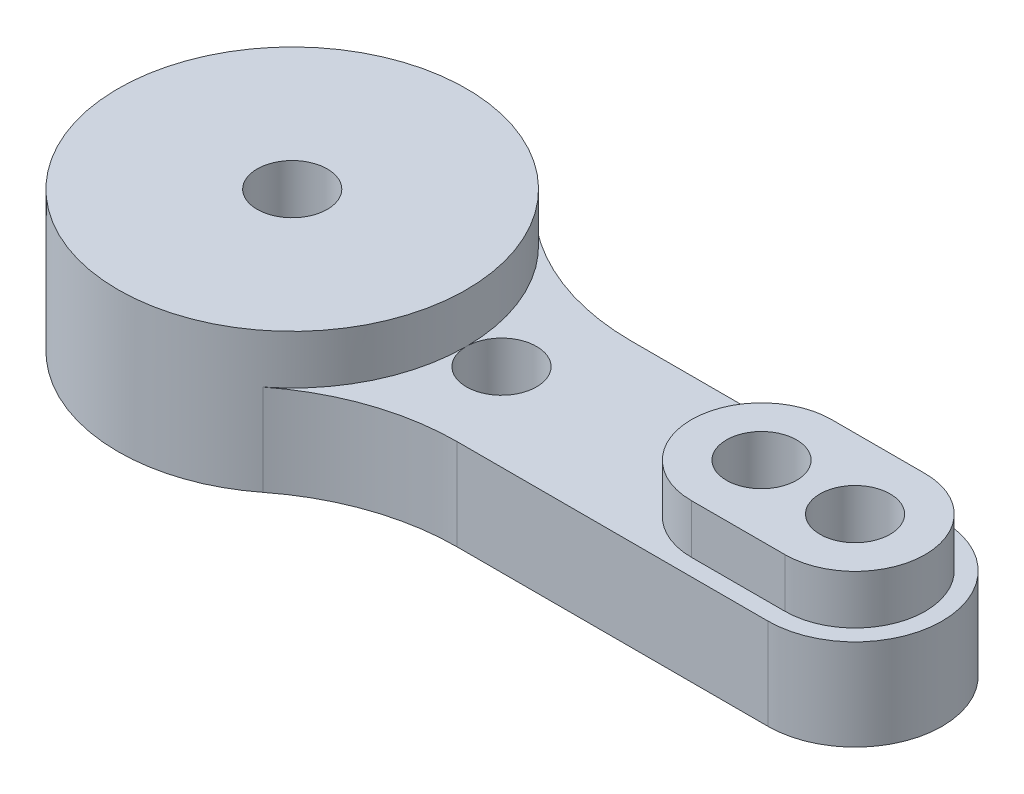
ISO-10303-21;
HEADER;
FILE_DESCRIPTION(('STEP AP214'),'2;1');
FILE_NAME('part.step','',(''),(''),'','','');
FILE_SCHEMA(('AUTOMOTIVE_DESIGN { 1 0 10303 214 1 1 1 1 }'));
ENDSEC;
DATA;
#1=APPLICATION_CONTEXT('core data for automotive mechanical design processes');
#2=APPLICATION_PROTOCOL_DEFINITION('international standard','automotive_design',2000,#1);
#3=PRODUCT_CONTEXT('',#1,'mechanical');
#4=PRODUCT('Part','Part','',(#3));
#5=PRODUCT_RELATED_PRODUCT_CATEGORY('part','',(#4));
#6=PRODUCT_DEFINITION_FORMATION('','',#4);
#7=PRODUCT_DEFINITION_CONTEXT('part definition',#1,'design');
#8=PRODUCT_DEFINITION('design','',#6,#7);
#9=PRODUCT_DEFINITION_SHAPE('','',#8);
#10=(LENGTH_UNIT() NAMED_UNIT(*) SI_UNIT(.MILLI.,.METRE.));
#11=(NAMED_UNIT(*) PLANE_ANGLE_UNIT() SI_UNIT($,.RADIAN.));
#12=(NAMED_UNIT(*) SI_UNIT($,.STERADIAN.) SOLID_ANGLE_UNIT());
#13=UNCERTAINTY_MEASURE_WITH_UNIT(LENGTH_MEASURE(1.E-05),#10,'distance_accuracy_value','');
#14=(GEOMETRIC_REPRESENTATION_CONTEXT(3) GLOBAL_UNCERTAINTY_ASSIGNED_CONTEXT((#13)) GLOBAL_UNIT_ASSIGNED_CONTEXT((#10,
#11,#12)) REPRESENTATION_CONTEXT('',''));
#15=CARTESIAN_POINT('',(0.,0.,0.));
#16=DIRECTION('',(0.,0.,1.));
#17=DIRECTION('',(1.,0.,0.));
#18=AXIS2_PLACEMENT_3D('',#15,#16,#17);
#19=CARTESIAN_POINT('',(0.,-3.9,-3.725));
#20=DIRECTION('',(0.,0.,1.));
#21=DIRECTION('',(1.,0.,0.));
#22=AXIS2_PLACEMENT_3D('',#19,#20,#21);
#23=PLANE('',#22);
#24=DIRECTION('',(1.,0.,0.));
#25=VECTOR('',#24,1.);
#26=CARTESIAN_POINT('',(0.,-3.9,-3.725));
#27=LINE('',#26,#25);
#28=CARTESIAN_POINT('',(10.7762180286035,-3.9,-3.725));
#29=VERTEX_POINT('',#28);
#30=CARTESIAN_POINT('',(24.0716502996323,-3.9,-3.725));
#31=VERTEX_POINT('',#30);
#32=EDGE_CURVE('E214',#29,#31,#27,.T.);
#33=ORIENTED_EDGE('',*,*,#32,.F.);
#34=DIRECTION('',(0.,-1.,0.));
#35=VECTOR('',#34,1.);
#36=CARTESIAN_POINT('',(10.7762180286035,0.,-3.725));
#37=LINE('',#36,#35);
#38=CARTESIAN_POINT('',(10.7762180286035,0.,-3.725));
#39=VERTEX_POINT('',#38);
#40=EDGE_CURVE('E136',#29,#39,#37,.F.);
#41=ORIENTED_EDGE('',*,*,#40,.T.);
#42=DIRECTION('',(1.,0.,0.));
#43=VECTOR('',#42,1.);
#44=CARTESIAN_POINT('',(0.,0.,-3.725));
#45=LINE('',#44,#43);
#46=CARTESIAN_POINT('',(24.0716502996323,0.,-3.725));
#47=VERTEX_POINT('',#46);
#48=EDGE_CURVE('E152',#39,#47,#45,.T.);
#49=ORIENTED_EDGE('',*,*,#48,.T.);
#50=DIRECTION('',(0.,1.,0.));
#51=VECTOR('',#50,1.);
#52=CARTESIAN_POINT('',(24.0716502996323,-3.9,-3.725));
#53=LINE('',#52,#51);
#54=EDGE_CURVE('E137',#31,#47,#53,.T.);
#55=ORIENTED_EDGE('',*,*,#54,.F.);
#56=EDGE_LOOP('',(#33,#41,#49,#55));
#57=FACE_BOUND('',#56,.T.);
#58=ADVANCED_FACE('F47',(#57),#23,.F.);
#59=CARTESIAN_POINT('',(24.0716502996323,-3.9,0.));
#60=DIRECTION('',(0.,1.,0.));
#61=DIRECTION('',(0.,0.,1.));
#62=AXIS2_PLACEMENT_3D('',#59,#60,#61);
#63=CYLINDRICAL_SURFACE('',#62,3.725);
#64=CARTESIAN_POINT('',(24.0716502996323,0.,0.));
#65=DIRECTION('',(0.,1.,0.));
#66=DIRECTION('',(0.,0.,1.));
#67=AXIS2_PLACEMENT_3D('',#64,#65,#66);
#68=CIRCLE('',#67,3.725);
#69=CARTESIAN_POINT('',(24.0716502996323,0.,3.725));
#70=VERTEX_POINT('',#69);
#71=EDGE_CURVE('E167',#70,#47,#68,.T.);
#72=ORIENTED_EDGE('',*,*,#71,.F.);
#73=DIRECTION('',(0.,1.,0.));
#74=VECTOR('',#73,1.);
#75=CARTESIAN_POINT('',(24.0716502996323,-3.9,3.725));
#76=LINE('',#75,#74);
#77=CARTESIAN_POINT('',(24.0716502996323,-3.9,3.725));
#78=VERTEX_POINT('',#77);
#79=EDGE_CURVE('E175',#78,#70,#76,.T.);
#80=ORIENTED_EDGE('',*,*,#79,.F.);
#81=CARTESIAN_POINT('',(24.0716502996323,-3.9,0.));
#82=DIRECTION('',(0.,1.,0.));
#83=DIRECTION('',(0.,0.,1.));
#84=AXIS2_PLACEMENT_3D('',#81,#82,#83);
#85=CIRCLE('',#84,3.725);
#86=EDGE_CURVE('E203',#78,#31,#85,.T.);
#87=ORIENTED_EDGE('',*,*,#86,.T.);
#88=ORIENTED_EDGE('',*,*,#54,.T.);
#89=EDGE_LOOP('',(#72,#80,#87,#88));
#90=FACE_BOUND('',#89,.T.);
#91=ADVANCED_FACE('F304',(#90),#63,.T.);
#92=CARTESIAN_POINT('',(0.,-3.9,3.725));
#93=DIRECTION('',(0.,0.,1.));
#94=DIRECTION('',(1.,0.,0.));
#95=AXIS2_PLACEMENT_3D('',#92,#93,#94);
#96=PLANE('',#95);
#97=DIRECTION('',(1.,0.,0.));
#98=VECTOR('',#97,1.);
#99=CARTESIAN_POINT('',(0.,0.,3.725));
#100=LINE('',#99,#98);
#101=CARTESIAN_POINT('',(10.7762180286035,0.,3.725));
#102=VERTEX_POINT('',#101);
#103=EDGE_CURVE('E157',#102,#70,#100,.T.);
#104=ORIENTED_EDGE('',*,*,#103,.F.);
#105=DIRECTION('',(0.,1.,0.));
#106=VECTOR('',#105,1.);
#107=CARTESIAN_POINT('',(10.7762180286035,-3.9,3.725));
#108=LINE('',#107,#106);
#109=CARTESIAN_POINT('',(10.7762180286035,-3.9,3.725));
#110=VERTEX_POINT('',#109);
#111=EDGE_CURVE('E63',#102,#110,#108,.F.);
#112=ORIENTED_EDGE('',*,*,#111,.T.);
#113=DIRECTION('',(1.,0.,0.));
#114=VECTOR('',#113,1.);
#115=CARTESIAN_POINT('',(0.,-3.9,3.725));
#116=LINE('',#115,#114);
#117=EDGE_CURVE('E207',#110,#78,#116,.T.);
#118=ORIENTED_EDGE('',*,*,#117,.T.);
#119=ORIENTED_EDGE('',*,*,#79,.T.);
#120=EDGE_LOOP('',(#104,#112,#118,#119));
#121=FACE_BOUND('',#120,.T.);
#122=ADVANCED_FACE('F309',(#121),#96,.T.);
#123=CARTESIAN_POINT('',(20.0716502996323,-3.9,0.));
#124=DIRECTION('',(0.,1.,0.));
#125=DIRECTION('',(0.,0.,1.));
#126=AXIS2_PLACEMENT_3D('',#123,#124,#125);
#127=CYLINDRICAL_SURFACE('',#126,1.5);
#128=CARTESIAN_POINT('',(20.0716502996323,-3.9,0.));
#129=DIRECTION('',(0.,1.,0.));
#130=DIRECTION('',(0.,0.,1.));
#131=AXIS2_PLACEMENT_3D('',#128,#129,#130);
#132=CIRCLE('',#131,1.5);
#133=CARTESIAN_POINT('',(20.0716502996323,-3.9,1.5));
#134=VERTEX_POINT('',#133);
#135=EDGE_CURVE('E197',#134,#134,#132,.T.);
#136=ORIENTED_EDGE('',*,*,#135,.F.);
#137=EDGE_LOOP('',(#136));
#138=FACE_BOUND('',#137,.T.);
#139=CARTESIAN_POINT('',(20.0716502996323,2.1,0.));
#140=DIRECTION('',(0.,1.,0.));
#141=DIRECTION('',(0.,0.,1.));
#142=AXIS2_PLACEMENT_3D('',#139,#140,#141);
#143=CIRCLE('',#142,1.5);
#144=CARTESIAN_POINT('',(20.0716502996323,2.1,1.5));
#145=VERTEX_POINT('',#144);
#146=EDGE_CURVE('E237',#145,#145,#143,.T.);
#147=ORIENTED_EDGE('',*,*,#146,.T.);
#148=EDGE_LOOP('',(#147));
#149=FACE_BOUND('',#148,.T.);
#150=ADVANCED_FACE('F298',(#138,#149),#127,.F.);
#151=CARTESIAN_POINT('',(0.,-3.9,0.));
#152=DIRECTION('',(0.,1.,0.));
#153=DIRECTION('',(0.,0.,1.));
#154=AXIS2_PLACEMENT_3D('',#151,#152,#153);
#155=CYLINDRICAL_SURFACE('',#154,1.5);
#156=CARTESIAN_POINT('',(0.,-3.9,0.));
#157=DIRECTION('',(0.,1.,0.));
#158=DIRECTION('',(0.,0.,1.));
#159=AXIS2_PLACEMENT_3D('',#156,#157,#158);
#160=CIRCLE('',#159,1.5);
#161=CARTESIAN_POINT('',(0.,-3.9,1.5));
#162=VERTEX_POINT('',#161);
#163=EDGE_CURVE('E200',#162,#162,#160,.T.);
#164=ORIENTED_EDGE('',*,*,#163,.F.);
#165=EDGE_LOOP('',(#164));
#166=FACE_BOUND('',#165,.T.);
#167=CARTESIAN_POINT('',(0.,2.1,0.));
#168=DIRECTION('',(0.,1.,0.));
#169=DIRECTION('',(0.,0.,1.));
#170=AXIS2_PLACEMENT_3D('',#167,#168,#169);
#171=CIRCLE('',#170,1.5);
#172=CARTESIAN_POINT('',(0.,2.1,1.5));
#173=VERTEX_POINT('',#172);
#174=EDGE_CURVE('E147',#173,#173,#171,.T.);
#175=ORIENTED_EDGE('',*,*,#174,.T.);
#176=EDGE_LOOP('',(#175));
#177=FACE_BOUND('',#176,.T.);
#178=ADVANCED_FACE('F278',(#166,#177),#155,.F.);
#179=CARTESIAN_POINT('',(0.,-3.9,0.));
#180=DIRECTION('',(0.,1.,0.));
#181=DIRECTION('',(0.,0.,1.));
#182=AXIS2_PLACEMENT_3D('',#179,#180,#181);
#183=CYLINDRICAL_SURFACE('',#182,7.45);
#184=CARTESIAN_POINT('',(0.,0.,0.));
#185=DIRECTION('',(0.,1.,0.));
#186=DIRECTION('',(0.,0.,1.));
#187=AXIS2_PLACEMENT_3D('',#184,#185,#186);
#188=CIRCLE('',#187,7.45);
#189=CARTESIAN_POINT('',(4.60073491765595,0.,-5.85967048710602));
#190=VERTEX_POINT('',#189);
#191=CARTESIAN_POINT('',(7.45,0.,0.));
#192=VERTEX_POINT('',#191);
#193=EDGE_CURVE('E129',#190,#192,#188,.F.);
#194=ORIENTED_EDGE('',*,*,#193,.F.);
#195=DIRECTION('',(0.,1.,0.));
#196=VECTOR('',#195,1.);
#197=CARTESIAN_POINT('',(4.60073491765595,-3.9,-5.85967048710602));
#198=LINE('',#197,#196);
#199=CARTESIAN_POINT('',(4.60073491765595,-3.9,-5.85967048710602));
#200=VERTEX_POINT('',#199);
#201=EDGE_CURVE('E184',#190,#200,#198,.F.);
#202=ORIENTED_EDGE('',*,*,#201,.T.);
#203=CARTESIAN_POINT('',(0.,-3.9,0.));
#204=DIRECTION('',(0.,1.,0.));
#205=DIRECTION('',(0.,0.,1.));
#206=AXIS2_PLACEMENT_3D('',#203,#204,#205);
#207=CIRCLE('',#206,7.45);
#208=CARTESIAN_POINT('',(4.60073491765595,-3.9,5.85967048710602));
#209=VERTEX_POINT('',#208);
#210=EDGE_CURVE('E210',#209,#200,#207,.F.);
#211=ORIENTED_EDGE('',*,*,#210,.F.);
#212=DIRECTION('',(0.,1.,0.));
#213=VECTOR('',#212,1.);
#214=CARTESIAN_POINT('',(4.60073491765595,-3.9,5.85967048710602));
#215=LINE('',#214,#213);
#216=CARTESIAN_POINT('',(4.60073491765595,0.,5.85967048710602));
#217=VERTEX_POINT('',#216);
#218=EDGE_CURVE('E133',#209,#217,#215,.T.);
#219=ORIENTED_EDGE('',*,*,#218,.T.);
#220=CARTESIAN_POINT('',(0.,0.,0.));
#221=DIRECTION('',(0.,1.,0.));
#222=DIRECTION('',(0.,0.,1.));
#223=AXIS2_PLACEMENT_3D('',#220,#221,#222);
#224=CIRCLE('',#223,7.45);
#225=EDGE_CURVE('E125',#217,#192,#224,.T.);
#226=ORIENTED_EDGE('',*,*,#225,.T.);
#227=EDGE_LOOP('',(#194,#202,#211,#219,#226));
#228=FACE_BOUND('',#227,.T.);
#229=CARTESIAN_POINT('',(0.,2.1,0.));
#230=DIRECTION('',(0.,1.,0.));
#231=DIRECTION('',(0.,0.,1.));
#232=AXIS2_PLACEMENT_3D('',#229,#230,#231);
#233=CIRCLE('',#232,7.45);
#234=CARTESIAN_POINT('',(0.,2.1,7.45));
#235=VERTEX_POINT('',#234);
#236=EDGE_CURVE('E250',#235,#235,#233,.F.);
#237=ORIENTED_EDGE('',*,*,#236,.T.);
#238=EDGE_LOOP('',(#237));
#239=FACE_BOUND('',#238,.T.);
#240=ADVANCED_FACE('F127',(#228,#239),#183,.T.);
#241=CARTESIAN_POINT('',(8.95,-3.9,0.));
#242=DIRECTION('',(0.,1.,0.));
#243=DIRECTION('',(0.,0.,1.));
#244=AXIS2_PLACEMENT_3D('',#241,#242,#243);
#245=CYLINDRICAL_SURFACE('',#244,1.5);
#246=CARTESIAN_POINT('',(8.95,-3.9,0.));
#247=DIRECTION('',(0.,1.,0.));
#248=DIRECTION('',(0.,0.,1.));
#249=AXIS2_PLACEMENT_3D('',#246,#247,#248);
#250=CIRCLE('',#249,1.5);
#251=CARTESIAN_POINT('',(8.95,-3.9,1.5));
#252=VERTEX_POINT('',#251);
#253=EDGE_CURVE('E171',#252,#252,#250,.T.);
#254=ORIENTED_EDGE('',*,*,#253,.F.);
#255=EDGE_LOOP('',(#254));
#256=FACE_BOUND('',#255,.T.);
#257=CARTESIAN_POINT('',(8.95,0.,0.));
#258=DIRECTION('',(0.,1.,0.));
#259=DIRECTION('',(0.,0.,1.));
#260=AXIS2_PLACEMENT_3D('',#257,#258,#259);
#261=CIRCLE('',#260,1.5);
#262=EDGE_CURVE('E142',#192,#192,#261,.T.);
#263=ORIENTED_EDGE('',*,*,#262,.T.);
#264=EDGE_LOOP('',(#263));
#265=FACE_BOUND('',#264,.T.);
#266=ADVANCED_FACE('F150',(#256,#265),#245,.F.);
#267=CARTESIAN_POINT('',(24.0716502996323,-3.9,0.));
#268=DIRECTION('',(0.,1.,0.));
#269=DIRECTION('',(0.,0.,1.));
#270=AXIS2_PLACEMENT_3D('',#267,#268,#269);
#271=CYLINDRICAL_SURFACE('',#270,1.5);
#272=CARTESIAN_POINT('',(24.0716502996323,-3.9,0.));
#273=DIRECTION('',(0.,1.,0.));
#274=DIRECTION('',(0.,0.,1.));
#275=AXIS2_PLACEMENT_3D('',#272,#273,#274);
#276=CIRCLE('',#275,1.5);
#277=CARTESIAN_POINT('',(24.0716502996323,-3.9,1.5));
#278=VERTEX_POINT('',#277);
#279=EDGE_CURVE('E162',#278,#278,#276,.T.);
#280=ORIENTED_EDGE('',*,*,#279,.F.);
#281=EDGE_LOOP('',(#280));
#282=FACE_BOUND('',#281,.T.);
#283=CARTESIAN_POINT('',(24.0716502996323,2.1,0.));
#284=DIRECTION('',(0.,1.,0.));
#285=DIRECTION('',(0.,0.,1.));
#286=AXIS2_PLACEMENT_3D('',#283,#284,#285);
#287=CIRCLE('',#286,1.5);
#288=CARTESIAN_POINT('',(24.0716502996323,2.1,1.5));
#289=VERTEX_POINT('',#288);
#290=EDGE_CURVE('E264',#289,#289,#287,.T.);
#291=ORIENTED_EDGE('',*,*,#290,.T.);
#292=EDGE_LOOP('',(#291));
#293=FACE_BOUND('',#292,.T.);
#294=ADVANCED_FACE('F294',(#282,#293),#271,.F.);
#295=CARTESIAN_POINT('',(0.,-3.9,0.));
#296=DIRECTION('',(0.,1.,0.));
#297=DIRECTION('',(0.,0.,1.));
#298=AXIS2_PLACEMENT_3D('',#295,#296,#297);
#299=PLANE('',#298);
#300=ORIENTED_EDGE('',*,*,#253,.T.);
#301=EDGE_LOOP('',(#300));
#302=FACE_BOUND('',#301,.T.);
#303=ORIENTED_EDGE('',*,*,#210,.T.);
#304=CARTESIAN_POINT('',(10.7762180286035,-3.9,-13.725));
#305=DIRECTION('',(0.,1.,0.));
#306=DIRECTION('',(0.,0.,1.));
#307=AXIS2_PLACEMENT_3D('',#304,#305,#306);
#308=CIRCLE('',#307,10.);
#309=EDGE_CURVE('E191',#200,#29,#308,.T.);
#310=ORIENTED_EDGE('',*,*,#309,.T.);
#311=ORIENTED_EDGE('',*,*,#32,.T.);
#312=ORIENTED_EDGE('',*,*,#86,.F.);
#313=ORIENTED_EDGE('',*,*,#117,.F.);
#314=CARTESIAN_POINT('',(10.7762180286035,-3.9,13.725));
#315=DIRECTION('',(0.,1.,0.));
#316=DIRECTION('',(0.,0.,1.));
#317=AXIS2_PLACEMENT_3D('',#314,#315,#316);
#318=CIRCLE('',#317,10.);
#319=EDGE_CURVE('E11',#110,#209,#318,.T.);
#320=ORIENTED_EDGE('',*,*,#319,.T.);
#321=EDGE_LOOP('',(#303,#310,#311,#312,#313,#320));
#322=FACE_BOUND('',#321,.T.);
#323=ORIENTED_EDGE('',*,*,#163,.T.);
#324=EDGE_LOOP('',(#323));
#325=FACE_BOUND('',#324,.T.);
#326=ORIENTED_EDGE('',*,*,#135,.T.);
#327=EDGE_LOOP('',(#326));
#328=FACE_BOUND('',#327,.T.);
#329=ORIENTED_EDGE('',*,*,#279,.T.);
#330=EDGE_LOOP('',(#329));
#331=FACE_BOUND('',#330,.T.);
#332=ADVANCED_FACE('F323',(#302,#322,#325,#328,#331),#299,.F.);
#333=CARTESIAN_POINT('',(0.,0.,0.));
#334=DIRECTION('',(0.,1.,0.));
#335=DIRECTION('',(0.,0.,1.));
#336=AXIS2_PLACEMENT_3D('',#333,#334,#335);
#337=PLANE('',#336);
#338=ORIENTED_EDGE('',*,*,#225,.F.);
#339=CARTESIAN_POINT('',(10.7762180286035,0.,13.725));
#340=DIRECTION('',(0.,1.,0.));
#341=DIRECTION('',(0.,0.,1.));
#342=AXIS2_PLACEMENT_3D('',#339,#340,#341);
#343=CIRCLE('',#342,10.);
#344=EDGE_CURVE('E56',#217,#102,#343,.F.);
#345=ORIENTED_EDGE('',*,*,#344,.T.);
#346=ORIENTED_EDGE('',*,*,#103,.T.);
#347=ORIENTED_EDGE('',*,*,#71,.T.);
#348=ORIENTED_EDGE('',*,*,#48,.F.);
#349=CARTESIAN_POINT('',(10.7762180286035,0.,-13.725));
#350=DIRECTION('',(0.,1.,0.));
#351=DIRECTION('',(0.,0.,1.));
#352=AXIS2_PLACEMENT_3D('',#349,#350,#351);
#353=CIRCLE('',#352,10.);
#354=EDGE_CURVE('E144',#39,#190,#353,.F.);
#355=ORIENTED_EDGE('',*,*,#354,.T.);
#356=ORIENTED_EDGE('',*,*,#193,.T.);
#357=ORIENTED_EDGE('',*,*,#262,.F.);
#358=EDGE_LOOP('',(#338,#345,#346,#347,#348,#355,#356,#357));
#359=FACE_BOUND('',#358,.T.);
#360=CARTESIAN_POINT('',(20.0716502996323,0.,0.));
#361=DIRECTION('',(0.,1.,0.));
#362=DIRECTION('',(0.,0.,1.));
#363=AXIS2_PLACEMENT_3D('',#360,#361,#362);
#364=CIRCLE('',#363,3.);
#365=CARTESIAN_POINT('',(20.0716502996323,0.,-3.));
#366=VERTEX_POINT('',#365);
#367=CARTESIAN_POINT('',(20.0716502996323,0.,3.));
#368=VERTEX_POINT('',#367);
#369=EDGE_CURVE('E242',#366,#368,#364,.T.);
#370=ORIENTED_EDGE('',*,*,#369,.F.);
#371=DIRECTION('',(-1.,0.,0.));
#372=VECTOR('',#371,1.);
#373=CARTESIAN_POINT('',(0.,0.,-3.));
#374=LINE('',#373,#372);
#375=CARTESIAN_POINT('',(24.0716502996323,0.,-3.));
#376=VERTEX_POINT('',#375);
#377=EDGE_CURVE('E246',#376,#366,#374,.T.);
#378=ORIENTED_EDGE('',*,*,#377,.F.);
#379=CARTESIAN_POINT('',(24.0716502996323,0.,0.));
#380=DIRECTION('',(0.,1.,0.));
#381=DIRECTION('',(0.,0.,1.));
#382=AXIS2_PLACEMENT_3D('',#379,#380,#381);
#383=CIRCLE('',#382,3.);
#384=CARTESIAN_POINT('',(24.0716502996323,0.,3.));
#385=VERTEX_POINT('',#384);
#386=EDGE_CURVE('E234',#385,#376,#383,.T.);
#387=ORIENTED_EDGE('',*,*,#386,.F.);
#388=DIRECTION('',(-1.,0.,0.));
#389=VECTOR('',#388,1.);
#390=CARTESIAN_POINT('',(0.,0.,3.00000000000001));
#391=LINE('',#390,#389);
#392=EDGE_CURVE('E238',#385,#368,#391,.T.);
#393=ORIENTED_EDGE('',*,*,#392,.T.);
#394=EDGE_LOOP('',(#370,#378,#387,#393));
#395=FACE_BOUND('',#394,.T.);
#396=ADVANCED_FACE('F140',(#359,#395),#337,.T.);
#397=CARTESIAN_POINT('',(0.,2.1,-3.));
#398=DIRECTION('',(0.,0.,1.));
#399=DIRECTION('',(1.,0.,0.));
#400=AXIS2_PLACEMENT_3D('',#397,#398,#399);
#401=PLANE('',#400);
#402=ORIENTED_EDGE('',*,*,#377,.T.);
#403=DIRECTION('',(0.,-1.,0.));
#404=VECTOR('',#403,1.);
#405=CARTESIAN_POINT('',(20.0716502996323,2.1,-3.));
#406=LINE('',#405,#404);
#407=CARTESIAN_POINT('',(20.0716502996323,2.1,-3.));
#408=VERTEX_POINT('',#407);
#409=EDGE_CURVE('E153',#408,#366,#406,.T.);
#410=ORIENTED_EDGE('',*,*,#409,.F.);
#411=DIRECTION('',(-1.,0.,0.));
#412=VECTOR('',#411,1.);
#413=CARTESIAN_POINT('',(0.,2.1,-3.));
#414=LINE('',#413,#412);
#415=CARTESIAN_POINT('',(24.0716502996323,2.1,-3.));
#416=VERTEX_POINT('',#415);
#417=EDGE_CURVE('E260',#416,#408,#414,.T.);
#418=ORIENTED_EDGE('',*,*,#417,.F.);
#419=DIRECTION('',(0.,-1.,0.));
#420=VECTOR('',#419,1.);
#421=CARTESIAN_POINT('',(24.0716502996323,2.1,-3.));
#422=LINE('',#421,#420);
#423=EDGE_CURVE('E229',#416,#376,#422,.T.);
#424=ORIENTED_EDGE('',*,*,#423,.T.);
#425=EDGE_LOOP('',(#402,#410,#418,#424));
#426=FACE_BOUND('',#425,.T.);
#427=ADVANCED_FACE('F340',(#426),#401,.F.);
#428=CARTESIAN_POINT('',(20.0716502996323,2.1,0.));
#429=DIRECTION('',(0.,-1.,0.));
#430=DIRECTION('',(0.,0.,-1.));
#431=AXIS2_PLACEMENT_3D('',#428,#429,#430);
#432=CYLINDRICAL_SURFACE('',#431,3.);
#433=ORIENTED_EDGE('',*,*,#369,.T.);
#434=DIRECTION('',(0.,-1.,0.));
#435=VECTOR('',#434,1.);
#436=CARTESIAN_POINT('',(20.0716502996323,2.1,3.));
#437=LINE('',#436,#435);
#438=CARTESIAN_POINT('',(20.0716502996323,2.1,3.));
#439=VERTEX_POINT('',#438);
#440=EDGE_CURVE('E159',#439,#368,#437,.T.);
#441=ORIENTED_EDGE('',*,*,#440,.F.);
#442=CARTESIAN_POINT('',(20.0716502996323,2.1,0.));
#443=DIRECTION('',(0.,1.,0.));
#444=DIRECTION('',(0.,0.,1.));
#445=AXIS2_PLACEMENT_3D('',#442,#443,#444);
#446=CIRCLE('',#445,3.);
#447=EDGE_CURVE('E257',#408,#439,#446,.T.);
#448=ORIENTED_EDGE('',*,*,#447,.F.);
#449=ORIENTED_EDGE('',*,*,#409,.T.);
#450=EDGE_LOOP('',(#433,#441,#448,#449));
#451=FACE_BOUND('',#450,.T.);
#452=ADVANCED_FACE('F344',(#451),#432,.T.);
#453=CARTESIAN_POINT('',(0.,2.1,3.00000000000001));
#454=DIRECTION('',(0.,0.,1.));
#455=DIRECTION('',(1.,0.,0.));
#456=AXIS2_PLACEMENT_3D('',#453,#454,#455);
#457=PLANE('',#456);
#458=ORIENTED_EDGE('',*,*,#392,.F.);
#459=DIRECTION('',(0.,-1.,0.));
#460=VECTOR('',#459,1.);
#461=CARTESIAN_POINT('',(24.0716502996323,2.1,3.));
#462=LINE('',#461,#460);
#463=CARTESIAN_POINT('',(24.0716502996323,2.1,3.));
#464=VERTEX_POINT('',#463);
#465=EDGE_CURVE('E225',#464,#385,#462,.T.);
#466=ORIENTED_EDGE('',*,*,#465,.F.);
#467=DIRECTION('',(-1.,0.,0.));
#468=VECTOR('',#467,1.);
#469=CARTESIAN_POINT('',(0.,2.1,3.00000000000001));
#470=LINE('',#469,#468);
#471=EDGE_CURVE('E253',#464,#439,#470,.T.);
#472=ORIENTED_EDGE('',*,*,#471,.T.);
#473=ORIENTED_EDGE('',*,*,#440,.T.);
#474=EDGE_LOOP('',(#458,#466,#472,#473));
#475=FACE_BOUND('',#474,.T.);
#476=ADVANCED_FACE('F348',(#475),#457,.T.);
#477=CARTESIAN_POINT('',(24.0716502996323,2.1,0.));
#478=DIRECTION('',(0.,-1.,0.));
#479=DIRECTION('',(0.,0.,-1.));
#480=AXIS2_PLACEMENT_3D('',#477,#478,#479);
#481=CYLINDRICAL_SURFACE('',#480,3.);
#482=ORIENTED_EDGE('',*,*,#386,.T.);
#483=ORIENTED_EDGE('',*,*,#423,.F.);
#484=CARTESIAN_POINT('',(24.0716502996323,2.1,0.));
#485=DIRECTION('',(0.,1.,0.));
#486=DIRECTION('',(0.,0.,1.));
#487=AXIS2_PLACEMENT_3D('',#484,#485,#486);
#488=CIRCLE('',#487,3.);
#489=EDGE_CURVE('E233',#464,#416,#488,.T.);
#490=ORIENTED_EDGE('',*,*,#489,.F.);
#491=ORIENTED_EDGE('',*,*,#465,.T.);
#492=EDGE_LOOP('',(#482,#483,#490,#491));
#493=FACE_BOUND('',#492,.T.);
#494=ADVANCED_FACE('F352',(#493),#481,.T.);
#495=CARTESIAN_POINT('',(0.,2.1,0.));
#496=DIRECTION('',(0.,1.,0.));
#497=DIRECTION('',(0.,0.,1.));
#498=AXIS2_PLACEMENT_3D('',#495,#496,#497);
#499=PLANE('',#498);
#500=ORIENTED_EDGE('',*,*,#146,.F.);
#501=EDGE_LOOP('',(#500));
#502=FACE_BOUND('',#501,.T.);
#503=ORIENTED_EDGE('',*,*,#290,.F.);
#504=EDGE_LOOP('',(#503));
#505=FACE_BOUND('',#504,.T.);
#506=ORIENTED_EDGE('',*,*,#417,.T.);
#507=ORIENTED_EDGE('',*,*,#447,.T.);
#508=ORIENTED_EDGE('',*,*,#471,.F.);
#509=ORIENTED_EDGE('',*,*,#489,.T.);
#510=EDGE_LOOP('',(#506,#507,#508,#509));
#511=FACE_BOUND('',#510,.T.);
#512=ADVANCED_FACE('F284',(#502,#505,#511),#499,.T.);
#513=CARTESIAN_POINT('',(0.,2.1,0.));
#514=DIRECTION('',(0.,1.,0.));
#515=DIRECTION('',(0.,0.,1.));
#516=AXIS2_PLACEMENT_3D('',#513,#514,#515);
#517=PLANE('',#516);
#518=ORIENTED_EDGE('',*,*,#174,.F.);
#519=EDGE_LOOP('',(#518));
#520=FACE_BOUND('',#519,.T.);
#521=ORIENTED_EDGE('',*,*,#236,.F.);
#522=EDGE_LOOP('',(#521));
#523=FACE_BOUND('',#522,.T.);
#524=ADVANCED_FACE('F280',(#520,#523),#517,.T.);
#525=CARTESIAN_POINT('',(10.7762180286035,-3.9,-13.725));
#526=DIRECTION('',(0.,1.,0.));
#527=DIRECTION('',(0.,0.,1.));
#528=AXIS2_PLACEMENT_3D('',#525,#526,#527);
#529=CYLINDRICAL_SURFACE('',#528,10.);
#530=ORIENTED_EDGE('',*,*,#309,.F.);
#531=ORIENTED_EDGE('',*,*,#201,.F.);
#532=ORIENTED_EDGE('',*,*,#354,.F.);
#533=ORIENTED_EDGE('',*,*,#40,.F.);
#534=EDGE_LOOP('',(#530,#531,#532,#533));
#535=FACE_BOUND('',#534,.T.);
#536=ADVANCED_FACE('F283',(#535),#529,.F.);
#537=CARTESIAN_POINT('',(10.7762180286035,-3.9,13.725));
#538=DIRECTION('',(0.,1.,0.));
#539=DIRECTION('',(0.,0.,1.));
#540=AXIS2_PLACEMENT_3D('',#537,#538,#539);
#541=CYLINDRICAL_SURFACE('',#540,10.);
#542=ORIENTED_EDGE('',*,*,#319,.F.);
#543=ORIENTED_EDGE('',*,*,#111,.F.);
#544=ORIENTED_EDGE('',*,*,#344,.F.);
#545=ORIENTED_EDGE('',*,*,#218,.F.);
#546=EDGE_LOOP('',(#542,#543,#544,#545));
#547=FACE_BOUND('',#546,.T.);
#548=ADVANCED_FACE('F49',(#547),#541,.F.);
#549=CLOSED_SHELL('',(#58,#91,#122,#150,#178,#240,#266,#294,#332,#396,#427,#452,#476,#494,#512,
#524,#536,#548));
#550=MANIFOLD_SOLID_BREP('B2',#549);
#551=ADVANCED_BREP_SHAPE_REPRESENTATION('',(#18,#550),#14);
#552=SHAPE_DEFINITION_REPRESENTATION(#9,#551);
ENDSEC;
END-ISO-10303-21;
